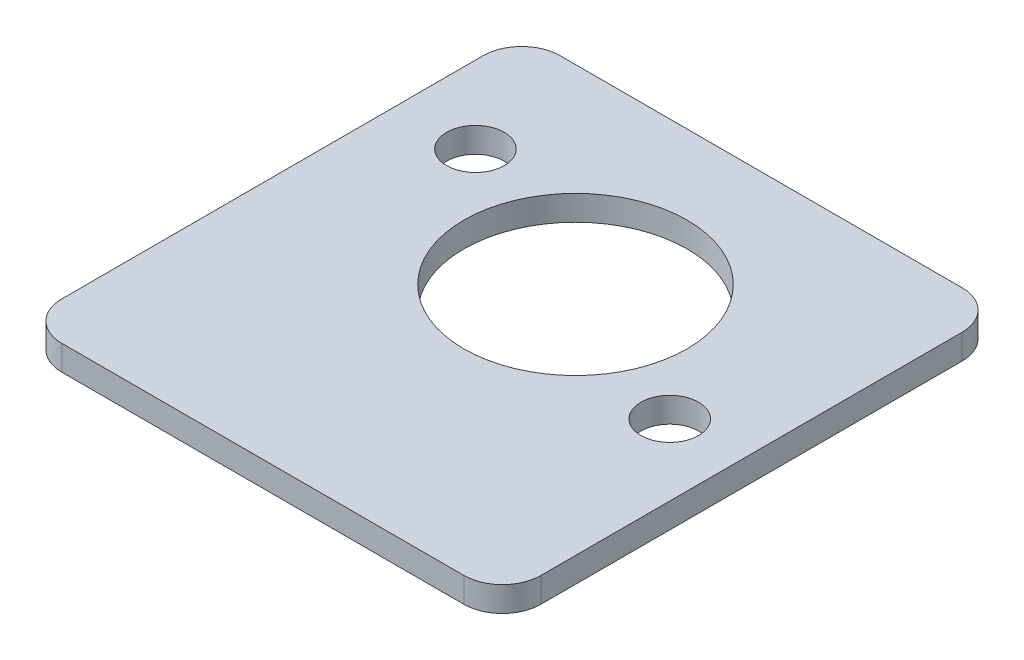
ISO-10303-21;
HEADER;
FILE_DESCRIPTION(('STEP AP214'),'2;1');
FILE_NAME('part.step','',(''),(''),'','','');
FILE_SCHEMA(('AUTOMOTIVE_DESIGN { 1 0 10303 214 1 1 1 1 }'));
ENDSEC;
DATA;
#1=APPLICATION_CONTEXT('core data for automotive mechanical design processes');
#2=APPLICATION_PROTOCOL_DEFINITION('international standard','automotive_design',2000,#1);
#3=PRODUCT_CONTEXT('',#1,'mechanical');
#4=PRODUCT('Part','Part','',(#3));
#5=PRODUCT_RELATED_PRODUCT_CATEGORY('part','',(#4));
#6=PRODUCT_DEFINITION_FORMATION('','',#4);
#7=PRODUCT_DEFINITION_CONTEXT('part definition',#1,'design');
#8=PRODUCT_DEFINITION('design','',#6,#7);
#9=PRODUCT_DEFINITION_SHAPE('','',#8);
#10=(LENGTH_UNIT() NAMED_UNIT(*) SI_UNIT(.MILLI.,.METRE.));
#11=(NAMED_UNIT(*) PLANE_ANGLE_UNIT() SI_UNIT($,.RADIAN.));
#12=(NAMED_UNIT(*) SI_UNIT($,.STERADIAN.) SOLID_ANGLE_UNIT());
#13=UNCERTAINTY_MEASURE_WITH_UNIT(LENGTH_MEASURE(1.E-05),#10,'distance_accuracy_value','');
#14=(GEOMETRIC_REPRESENTATION_CONTEXT(3) GLOBAL_UNCERTAINTY_ASSIGNED_CONTEXT((#13)) GLOBAL_UNIT_ASSIGNED_CONTEXT((#10,
#11,#12)) REPRESENTATION_CONTEXT('',''));
#15=CARTESIAN_POINT('',(0.,0.,0.));
#16=DIRECTION('',(0.,0.,1.));
#17=DIRECTION('',(1.,0.,0.));
#18=AXIS2_PLACEMENT_3D('',#15,#16,#17);
#19=CARTESIAN_POINT('',(0.,3.302,0.));
#20=DIRECTION('',(-1.,0.,0.));
#21=DIRECTION('',(0.,0.,1.));
#22=AXIS2_PLACEMENT_3D('',#19,#20,#21);
#23=PLANE('',#22);
#24=DIRECTION('',(0.,0.,-1.));
#25=VECTOR('',#24,1.);
#26=CARTESIAN_POINT('',(0.,0.,0.));
#27=LINE('',#26,#25);
#28=CARTESIAN_POINT('',(0.,0.,-5.08));
#29=VERTEX_POINT('',#28);
#30=CARTESIAN_POINT('',(0.,0.,-60.706));
#31=VERTEX_POINT('',#30);
#32=EDGE_CURVE('E142',#29,#31,#27,.T.);
#33=ORIENTED_EDGE('',*,*,#32,.T.);
#34=DIRECTION('',(0.,-1.,0.));
#35=VECTOR('',#34,1.);
#36=CARTESIAN_POINT('',(0.,3.302,-60.706));
#37=LINE('',#36,#35);
#38=CARTESIAN_POINT('',(0.,3.302,-60.706));
#39=VERTEX_POINT('',#38);
#40=EDGE_CURVE('E176',#31,#39,#37,.F.);
#41=ORIENTED_EDGE('',*,*,#40,.T.);
#42=DIRECTION('',(0.,0.,-1.));
#43=VECTOR('',#42,1.);
#44=CARTESIAN_POINT('',(0.,3.302,0.));
#45=LINE('',#44,#43);
#46=CARTESIAN_POINT('',(0.,3.302,-5.08));
#47=VERTEX_POINT('',#46);
#48=EDGE_CURVE('E140',#47,#39,#45,.T.);
#49=ORIENTED_EDGE('',*,*,#48,.F.);
#50=DIRECTION('',(0.,-1.,0.));
#51=VECTOR('',#50,1.);
#52=CARTESIAN_POINT('',(0.,3.302,-5.08));
#53=LINE('',#52,#51);
#54=EDGE_CURVE('E172',#47,#29,#53,.T.);
#55=ORIENTED_EDGE('',*,*,#54,.T.);
#56=EDGE_LOOP('',(#33,#41,#49,#55));
#57=FACE_BOUND('',#56,.T.);
#58=ADVANCED_FACE('F39',(#57),#23,.F.);
#59=CARTESIAN_POINT('',(0.,3.302,-65.786));
#60=DIRECTION('',(0.,0.,1.));
#61=DIRECTION('',(1.,0.,0.));
#62=AXIS2_PLACEMENT_3D('',#59,#60,#61);
#63=PLANE('',#62);
#64=DIRECTION('',(-1.,0.,0.));
#65=VECTOR('',#64,1.);
#66=CARTESIAN_POINT('',(0.,0.,-65.786));
#67=LINE('',#66,#65);
#68=CARTESIAN_POINT('',(-5.08,0.,-65.786));
#69=VERTEX_POINT('',#68);
#70=CARTESIAN_POINT('',(-58.166,0.,-65.786));
#71=VERTEX_POINT('',#70);
#72=EDGE_CURVE('E136',#69,#71,#67,.T.);
#73=ORIENTED_EDGE('',*,*,#72,.T.);
#74=DIRECTION('',(0.,-1.,0.));
#75=VECTOR('',#74,1.);
#76=CARTESIAN_POINT('',(-58.166,3.302,-65.786));
#77=LINE('',#76,#75);
#78=CARTESIAN_POINT('',(-58.166,3.302,-65.786));
#79=VERTEX_POINT('',#78);
#80=EDGE_CURVE('E112',#71,#79,#77,.F.);
#81=ORIENTED_EDGE('',*,*,#80,.T.);
#82=DIRECTION('',(-1.,0.,0.));
#83=VECTOR('',#82,1.);
#84=CARTESIAN_POINT('',(0.,3.302,-65.786));
#85=LINE('',#84,#83);
#86=CARTESIAN_POINT('',(-5.08,3.302,-65.786));
#87=VERTEX_POINT('',#86);
#88=EDGE_CURVE('E205',#87,#79,#85,.T.);
#89=ORIENTED_EDGE('',*,*,#88,.F.);
#90=DIRECTION('',(0.,-1.,0.));
#91=VECTOR('',#90,1.);
#92=CARTESIAN_POINT('',(-5.08,3.302,-65.786));
#93=LINE('',#92,#91);
#94=EDGE_CURVE('E118',#87,#69,#93,.T.);
#95=ORIENTED_EDGE('',*,*,#94,.T.);
#96=EDGE_LOOP('',(#73,#81,#89,#95));
#97=FACE_BOUND('',#96,.T.);
#98=ADVANCED_FACE('F238',(#97),#63,.F.);
#99=CARTESIAN_POINT('',(-63.246,3.302,0.));
#100=DIRECTION('',(1.,0.,0.));
#101=DIRECTION('',(0.,0.,-1.));
#102=AXIS2_PLACEMENT_3D('',#99,#100,#101);
#103=PLANE('',#102);
#104=DIRECTION('',(0.,0.,1.));
#105=VECTOR('',#104,1.);
#106=CARTESIAN_POINT('',(-63.246,3.302,0.));
#107=LINE('',#106,#105);
#108=CARTESIAN_POINT('',(-63.246,3.302,-60.706));
#109=VERTEX_POINT('',#108);
#110=CARTESIAN_POINT('',(-63.246,3.302,-5.08));
#111=VERTEX_POINT('',#110);
#112=EDGE_CURVE('E127',#109,#111,#107,.T.);
#113=ORIENTED_EDGE('',*,*,#112,.F.);
#114=DIRECTION('',(0.,-1.,0.));
#115=VECTOR('',#114,1.);
#116=CARTESIAN_POINT('',(-63.246,3.302,-60.706));
#117=LINE('',#116,#115);
#118=CARTESIAN_POINT('',(-63.246,0.,-60.706));
#119=VERTEX_POINT('',#118);
#120=EDGE_CURVE('E111',#109,#119,#117,.T.);
#121=ORIENTED_EDGE('',*,*,#120,.T.);
#122=DIRECTION('',(0.,0.,1.));
#123=VECTOR('',#122,1.);
#124=CARTESIAN_POINT('',(-63.246,0.,0.));
#125=LINE('',#124,#123);
#126=CARTESIAN_POINT('',(-63.246,0.,-5.08));
#127=VERTEX_POINT('',#126);
#128=EDGE_CURVE('E125',#119,#127,#125,.T.);
#129=ORIENTED_EDGE('',*,*,#128,.T.);
#130=DIRECTION('',(0.,-1.,0.));
#131=VECTOR('',#130,1.);
#132=CARTESIAN_POINT('',(-63.246,3.302,-5.08));
#133=LINE('',#132,#131);
#134=EDGE_CURVE('E130',#127,#111,#133,.F.);
#135=ORIENTED_EDGE('',*,*,#134,.T.);
#136=EDGE_LOOP('',(#113,#121,#129,#135));
#137=FACE_BOUND('',#136,.T.);
#138=ADVANCED_FACE('F124',(#137),#103,.F.);
#139=CARTESIAN_POINT('',(0.,3.302,0.));
#140=DIRECTION('',(0.,0.,-1.));
#141=DIRECTION('',(-1.,0.,0.));
#142=AXIS2_PLACEMENT_3D('',#139,#140,#141);
#143=PLANE('',#142);
#144=DIRECTION('',(1.,0.,0.));
#145=VECTOR('',#144,1.);
#146=CARTESIAN_POINT('',(0.,0.,0.));
#147=LINE('',#146,#145);
#148=CARTESIAN_POINT('',(-58.166,0.,0.));
#149=VERTEX_POINT('',#148);
#150=CARTESIAN_POINT('',(-5.08,0.,0.));
#151=VERTEX_POINT('',#150);
#152=EDGE_CURVE('E135',#149,#151,#147,.T.);
#153=ORIENTED_EDGE('',*,*,#152,.T.);
#154=DIRECTION('',(0.,-1.,0.));
#155=VECTOR('',#154,1.);
#156=CARTESIAN_POINT('',(-5.08,3.302,0.));
#157=LINE('',#156,#155);
#158=CARTESIAN_POINT('',(-5.08,3.302,0.));
#159=VERTEX_POINT('',#158);
#160=EDGE_CURVE('E11',#151,#159,#157,.F.);
#161=ORIENTED_EDGE('',*,*,#160,.T.);
#162=DIRECTION('',(1.,0.,0.));
#163=VECTOR('',#162,1.);
#164=CARTESIAN_POINT('',(0.,3.302,0.));
#165=LINE('',#164,#163);
#166=CARTESIAN_POINT('',(-58.166,3.302,0.));
#167=VERTEX_POINT('',#166);
#168=EDGE_CURVE('E147',#167,#159,#165,.T.);
#169=ORIENTED_EDGE('',*,*,#168,.F.);
#170=DIRECTION('',(0.,-1.,0.));
#171=VECTOR('',#170,1.);
#172=CARTESIAN_POINT('',(-58.166,3.302,0.));
#173=LINE('',#172,#171);
#174=EDGE_CURVE('E49',#167,#149,#173,.T.);
#175=ORIENTED_EDGE('',*,*,#174,.T.);
#176=EDGE_LOOP('',(#153,#161,#169,#175));
#177=FACE_BOUND('',#176,.T.);
#178=ADVANCED_FACE('F230',(#177),#143,.F.);
#179=CARTESIAN_POINT('',(0.,3.302,0.));
#180=DIRECTION('',(0.,1.,0.));
#181=DIRECTION('',(0.,0.,1.));
#182=AXIS2_PLACEMENT_3D('',#179,#180,#181);
#183=PLANE('',#182);
#184=CARTESIAN_POINT('',(-9.398,3.302,-31.496));
#185=DIRECTION('',(0.,1.,0.));
#186=DIRECTION('',(0.,0.,1.));
#187=AXIS2_PLACEMENT_3D('',#184,#185,#186);
#188=CIRCLE('',#187,3.81);
#189=CARTESIAN_POINT('',(-9.398,3.302,-27.686));
#190=VERTEX_POINT('',#189);
#191=EDGE_CURVE('E216',#190,#190,#188,.T.);
#192=ORIENTED_EDGE('',*,*,#191,.F.);
#193=EDGE_LOOP('',(#192));
#194=FACE_BOUND('',#193,.T.);
#195=CARTESIAN_POINT('',(-53.086,3.302,-49.53));
#196=DIRECTION('',(0.,1.,0.));
#197=DIRECTION('',(0.,0.,1.));
#198=AXIS2_PLACEMENT_3D('',#195,#196,#197);
#199=CIRCLE('',#198,3.81);
#200=CARTESIAN_POINT('',(-53.086,3.302,-45.72));
#201=VERTEX_POINT('',#200);
#202=EDGE_CURVE('E215',#201,#201,#199,.T.);
#203=ORIENTED_EDGE('',*,*,#202,.F.);
#204=EDGE_LOOP('',(#203));
#205=FACE_BOUND('',#204,.T.);
#206=CARTESIAN_POINT('',(-30.988,3.302,-40.64));
#207=DIRECTION('',(0.,1.,0.));
#208=DIRECTION('',(0.,0.,1.));
#209=AXIS2_PLACEMENT_3D('',#206,#207,#208);
#210=CIRCLE('',#209,14.732);
#211=CARTESIAN_POINT('',(-30.988,3.302,-25.908));
#212=VERTEX_POINT('',#211);
#213=EDGE_CURVE('E186',#212,#212,#210,.T.);
#214=ORIENTED_EDGE('',*,*,#213,.F.);
#215=EDGE_LOOP('',(#214));
#216=FACE_BOUND('',#215,.T.);
#217=ORIENTED_EDGE('',*,*,#88,.T.);
#218=CARTESIAN_POINT('',(-58.166,3.302,-60.706));
#219=DIRECTION('',(0.,1.,0.));
#220=DIRECTION('',(0.,0.,1.));
#221=AXIS2_PLACEMENT_3D('',#218,#219,#220);
#222=CIRCLE('',#221,5.08);
#223=EDGE_CURVE('E169',#79,#109,#222,.T.);
#224=ORIENTED_EDGE('',*,*,#223,.T.);
#225=ORIENTED_EDGE('',*,*,#112,.T.);
#226=CARTESIAN_POINT('',(-58.166,3.302,-5.08));
#227=DIRECTION('',(0.,1.,0.));
#228=DIRECTION('',(0.,0.,1.));
#229=AXIS2_PLACEMENT_3D('',#226,#227,#228);
#230=CIRCLE('',#229,5.08);
#231=EDGE_CURVE('E62',#111,#167,#230,.T.);
#232=ORIENTED_EDGE('',*,*,#231,.T.);
#233=ORIENTED_EDGE('',*,*,#168,.T.);
#234=CARTESIAN_POINT('',(-5.08,3.302,-5.08));
#235=DIRECTION('',(0.,1.,0.));
#236=DIRECTION('',(0.,0.,1.));
#237=AXIS2_PLACEMENT_3D('',#234,#235,#236);
#238=CIRCLE('',#237,5.08);
#239=EDGE_CURVE('E163',#159,#47,#238,.T.);
#240=ORIENTED_EDGE('',*,*,#239,.T.);
#241=ORIENTED_EDGE('',*,*,#48,.T.);
#242=CARTESIAN_POINT('',(-5.08,3.302,-60.706));
#243=DIRECTION('',(0.,1.,0.));
#244=DIRECTION('',(0.,0.,1.));
#245=AXIS2_PLACEMENT_3D('',#242,#243,#244);
#246=CIRCLE('',#245,5.08);
#247=EDGE_CURVE('E166',#39,#87,#246,.T.);
#248=ORIENTED_EDGE('',*,*,#247,.T.);
#249=EDGE_LOOP('',(#217,#224,#225,#232,#233,#240,#241,#248));
#250=FACE_BOUND('',#249,.T.);
#251=ADVANCED_FACE('F227',(#194,#205,#216,#250),#183,.T.);
#252=CARTESIAN_POINT('',(0.,0.,0.));
#253=DIRECTION('',(0.,1.,0.));
#254=DIRECTION('',(0.,0.,1.));
#255=AXIS2_PLACEMENT_3D('',#252,#253,#254);
#256=PLANE('',#255);
#257=CARTESIAN_POINT('',(-9.398,0.,-31.496));
#258=DIRECTION('',(0.,1.,0.));
#259=DIRECTION('',(0.,0.,1.));
#260=AXIS2_PLACEMENT_3D('',#257,#258,#259);
#261=CIRCLE('',#260,3.81);
#262=CARTESIAN_POINT('',(-9.398,0.,-27.686));
#263=VERTEX_POINT('',#262);
#264=EDGE_CURVE('E43',#263,#263,#261,.T.);
#265=ORIENTED_EDGE('',*,*,#264,.T.);
#266=EDGE_LOOP('',(#265));
#267=FACE_BOUND('',#266,.T.);
#268=CARTESIAN_POINT('',(-53.086,0.,-49.53));
#269=DIRECTION('',(0.,1.,0.));
#270=DIRECTION('',(0.,0.,1.));
#271=AXIS2_PLACEMENT_3D('',#268,#269,#270);
#272=CIRCLE('',#271,3.81);
#273=CARTESIAN_POINT('',(-53.086,0.,-45.72));
#274=VERTEX_POINT('',#273);
#275=EDGE_CURVE('E185',#274,#274,#272,.T.);
#276=ORIENTED_EDGE('',*,*,#275,.T.);
#277=EDGE_LOOP('',(#276));
#278=FACE_BOUND('',#277,.T.);
#279=CARTESIAN_POINT('',(-30.988,0.,-40.64));
#280=DIRECTION('',(0.,1.,0.));
#281=DIRECTION('',(0.,0.,1.));
#282=AXIS2_PLACEMENT_3D('',#279,#280,#281);
#283=CIRCLE('',#282,14.732);
#284=CARTESIAN_POINT('',(-30.988,0.,-25.908));
#285=VERTEX_POINT('',#284);
#286=EDGE_CURVE('E182',#285,#285,#283,.T.);
#287=ORIENTED_EDGE('',*,*,#286,.T.);
#288=EDGE_LOOP('',(#287));
#289=FACE_BOUND('',#288,.T.);
#290=ORIENTED_EDGE('',*,*,#128,.F.);
#291=CARTESIAN_POINT('',(-58.166,0.,-60.706));
#292=DIRECTION('',(0.,1.,0.));
#293=DIRECTION('',(0.,0.,1.));
#294=AXIS2_PLACEMENT_3D('',#291,#292,#293);
#295=CIRCLE('',#294,5.08);
#296=EDGE_CURVE('E107',#119,#71,#295,.F.);
#297=ORIENTED_EDGE('',*,*,#296,.T.);
#298=ORIENTED_EDGE('',*,*,#72,.F.);
#299=CARTESIAN_POINT('',(-5.08,0.,-60.706));
#300=DIRECTION('',(0.,1.,0.));
#301=DIRECTION('',(0.,0.,1.));
#302=AXIS2_PLACEMENT_3D('',#299,#300,#301);
#303=CIRCLE('',#302,5.08);
#304=EDGE_CURVE('E119',#69,#31,#303,.F.);
#305=ORIENTED_EDGE('',*,*,#304,.T.);
#306=ORIENTED_EDGE('',*,*,#32,.F.);
#307=CARTESIAN_POINT('',(-5.08,0.,-5.08));
#308=DIRECTION('',(0.,1.,0.));
#309=DIRECTION('',(0.,0.,1.));
#310=AXIS2_PLACEMENT_3D('',#307,#308,#309);
#311=CIRCLE('',#310,5.08);
#312=EDGE_CURVE('E151',#29,#151,#311,.F.);
#313=ORIENTED_EDGE('',*,*,#312,.T.);
#314=ORIENTED_EDGE('',*,*,#152,.F.);
#315=CARTESIAN_POINT('',(-58.166,0.,-5.08));
#316=DIRECTION('',(0.,1.,0.));
#317=DIRECTION('',(0.,0.,1.));
#318=AXIS2_PLACEMENT_3D('',#315,#316,#317);
#319=CIRCLE('',#318,5.08);
#320=EDGE_CURVE('E129',#149,#127,#319,.F.);
#321=ORIENTED_EDGE('',*,*,#320,.T.);
#322=EDGE_LOOP('',(#290,#297,#298,#305,#306,#313,#314,#321));
#323=FACE_BOUND('',#322,.T.);
#324=ADVANCED_FACE('F132',(#267,#278,#289,#323),#256,.F.);
#325=CARTESIAN_POINT('',(-58.166,3.302,-60.706));
#326=DIRECTION('',(0.,-1.,0.));
#327=DIRECTION('',(0.,0.,-1.));
#328=AXIS2_PLACEMENT_3D('',#325,#326,#327);
#329=CYLINDRICAL_SURFACE('',#328,5.08);
#330=ORIENTED_EDGE('',*,*,#223,.F.);
#331=ORIENTED_EDGE('',*,*,#80,.F.);
#332=ORIENTED_EDGE('',*,*,#296,.F.);
#333=ORIENTED_EDGE('',*,*,#120,.F.);
#334=EDGE_LOOP('',(#330,#331,#332,#333));
#335=FACE_BOUND('',#334,.T.);
#336=ADVANCED_FACE('F110',(#335),#329,.T.);
#337=CARTESIAN_POINT('',(-5.08,3.302,-60.706));
#338=DIRECTION('',(0.,-1.,0.));
#339=DIRECTION('',(0.,0.,-1.));
#340=AXIS2_PLACEMENT_3D('',#337,#338,#339);
#341=CYLINDRICAL_SURFACE('',#340,5.08);
#342=ORIENTED_EDGE('',*,*,#247,.F.);
#343=ORIENTED_EDGE('',*,*,#40,.F.);
#344=ORIENTED_EDGE('',*,*,#304,.F.);
#345=ORIENTED_EDGE('',*,*,#94,.F.);
#346=EDGE_LOOP('',(#342,#343,#344,#345));
#347=FACE_BOUND('',#346,.T.);
#348=ADVANCED_FACE('F240',(#347),#341,.T.);
#349=CARTESIAN_POINT('',(-5.08,3.302,-5.08));
#350=DIRECTION('',(0.,-1.,0.));
#351=DIRECTION('',(0.,0.,-1.));
#352=AXIS2_PLACEMENT_3D('',#349,#350,#351);
#353=CYLINDRICAL_SURFACE('',#352,5.08);
#354=ORIENTED_EDGE('',*,*,#239,.F.);
#355=ORIENTED_EDGE('',*,*,#160,.F.);
#356=ORIENTED_EDGE('',*,*,#312,.F.);
#357=ORIENTED_EDGE('',*,*,#54,.F.);
#358=EDGE_LOOP('',(#354,#355,#356,#357));
#359=FACE_BOUND('',#358,.T.);
#360=ADVANCED_FACE('F245',(#359),#353,.T.);
#361=CARTESIAN_POINT('',(-58.166,3.302,-5.08));
#362=DIRECTION('',(0.,-1.,0.));
#363=DIRECTION('',(0.,0.,-1.));
#364=AXIS2_PLACEMENT_3D('',#361,#362,#363);
#365=CYLINDRICAL_SURFACE('',#364,5.08);
#366=ORIENTED_EDGE('',*,*,#231,.F.);
#367=ORIENTED_EDGE('',*,*,#134,.F.);
#368=ORIENTED_EDGE('',*,*,#320,.F.);
#369=ORIENTED_EDGE('',*,*,#174,.F.);
#370=EDGE_LOOP('',(#366,#367,#368,#369));
#371=FACE_BOUND('',#370,.T.);
#372=ADVANCED_FACE('F41',(#371),#365,.T.);
#373=CARTESIAN_POINT('',(-30.988,-6.35,-40.64));
#374=DIRECTION('',(0.,1.,0.));
#375=DIRECTION('',(0.,0.,1.));
#376=AXIS2_PLACEMENT_3D('',#373,#374,#375);
#377=CYLINDRICAL_SURFACE('',#376,14.732);
#378=ORIENTED_EDGE('',*,*,#213,.T.);
#379=EDGE_LOOP('',(#378));
#380=FACE_BOUND('',#379,.T.);
#381=ORIENTED_EDGE('',*,*,#286,.F.);
#382=EDGE_LOOP('',(#381));
#383=FACE_BOUND('',#382,.T.);
#384=ADVANCED_FACE('F262',(#380,#383),#377,.F.);
#385=CARTESIAN_POINT('',(-53.086,-6.35,-49.53));
#386=DIRECTION('',(0.,1.,0.));
#387=DIRECTION('',(0.,0.,1.));
#388=AXIS2_PLACEMENT_3D('',#385,#386,#387);
#389=CYLINDRICAL_SURFACE('',#388,3.81);
#390=ORIENTED_EDGE('',*,*,#202,.T.);
#391=EDGE_LOOP('',(#390));
#392=FACE_BOUND('',#391,.T.);
#393=ORIENTED_EDGE('',*,*,#275,.F.);
#394=EDGE_LOOP('',(#393));
#395=FACE_BOUND('',#394,.T.);
#396=ADVANCED_FACE('F224',(#392,#395),#389,.F.);
#397=CARTESIAN_POINT('',(-9.398,-6.35,-31.496));
#398=DIRECTION('',(0.,1.,0.));
#399=DIRECTION('',(0.,0.,1.));
#400=AXIS2_PLACEMENT_3D('',#397,#398,#399);
#401=CYLINDRICAL_SURFACE('',#400,3.81);
#402=ORIENTED_EDGE('',*,*,#191,.T.);
#403=EDGE_LOOP('',(#402));
#404=FACE_BOUND('',#403,.T.);
#405=ORIENTED_EDGE('',*,*,#264,.F.);
#406=EDGE_LOOP('',(#405));
#407=FACE_BOUND('',#406,.T.);
#408=ADVANCED_FACE('F272',(#404,#407),#401,.F.);
#409=CLOSED_SHELL('',(#58,#98,#138,#178,#251,#324,#336,#348,#360,#372,#384,#396,#408));
#410=MANIFOLD_SOLID_BREP('B2',#409);
#411=ADVANCED_BREP_SHAPE_REPRESENTATION('',(#18,#410),#14);
#412=SHAPE_DEFINITION_REPRESENTATION(#9,#411);
ENDSEC;
END-ISO-10303-21;
